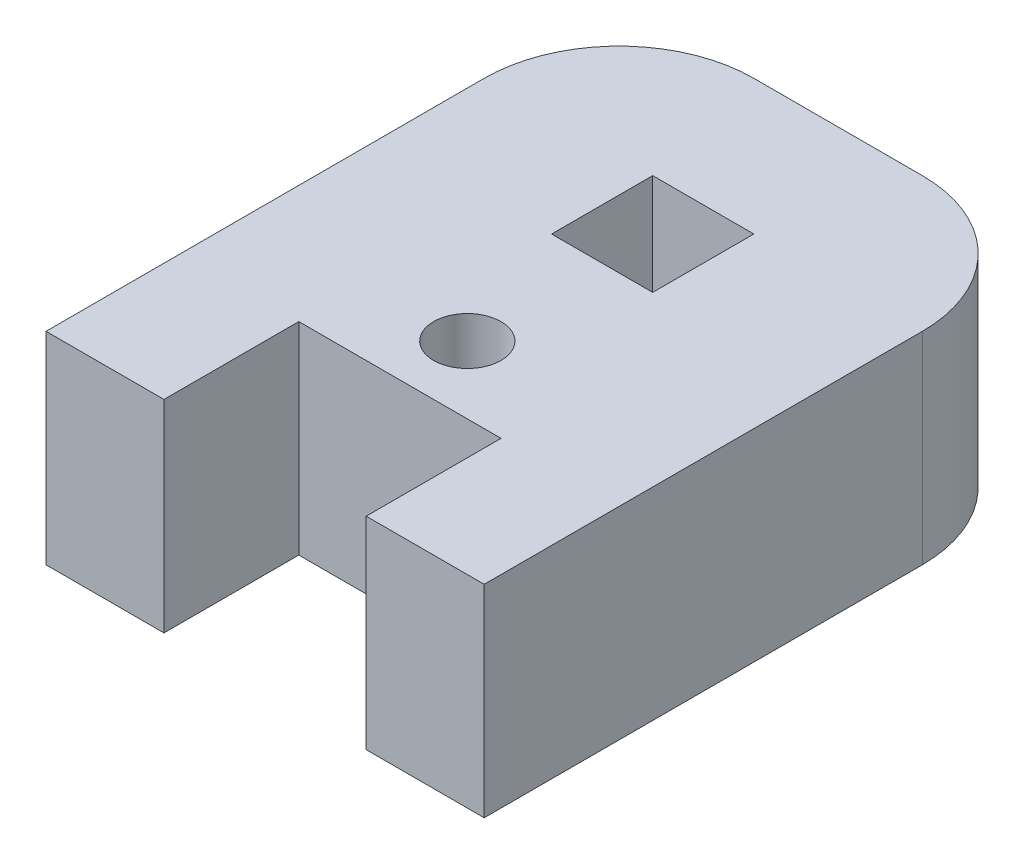
ISO-10303-21;
HEADER;
FILE_DESCRIPTION(('STEP AP214'),'2;1');
FILE_NAME('part.step','',(''),(''),'','','');
FILE_SCHEMA(('AUTOMOTIVE_DESIGN { 1 0 10303 214 1 1 1 1 }'));
ENDSEC;
DATA;
#1=APPLICATION_CONTEXT('core data for automotive mechanical design processes');
#2=APPLICATION_PROTOCOL_DEFINITION('international standard','automotive_design',2000,#1);
#3=PRODUCT_CONTEXT('',#1,'mechanical');
#4=PRODUCT('Part','Part','',(#3));
#5=PRODUCT_RELATED_PRODUCT_CATEGORY('part','',(#4));
#6=PRODUCT_DEFINITION_FORMATION('','',#4);
#7=PRODUCT_DEFINITION_CONTEXT('part definition',#1,'design');
#8=PRODUCT_DEFINITION('design','',#6,#7);
#9=PRODUCT_DEFINITION_SHAPE('','',#8);
#10=(LENGTH_UNIT() NAMED_UNIT(*) SI_UNIT(.MILLI.,.METRE.));
#11=(NAMED_UNIT(*) PLANE_ANGLE_UNIT() SI_UNIT($,.RADIAN.));
#12=(NAMED_UNIT(*) SI_UNIT($,.STERADIAN.) SOLID_ANGLE_UNIT());
#13=UNCERTAINTY_MEASURE_WITH_UNIT(LENGTH_MEASURE(1.E-05),#10,'distance_accuracy_value','');
#14=(GEOMETRIC_REPRESENTATION_CONTEXT(3) GLOBAL_UNCERTAINTY_ASSIGNED_CONTEXT((#13)) GLOBAL_UNIT_ASSIGNED_CONTEXT((#10,
#11,#12)) REPRESENTATION_CONTEXT('',''));
#15=CARTESIAN_POINT('',(0.,0.,0.));
#16=DIRECTION('',(0.,0.,1.));
#17=DIRECTION('',(1.,0.,0.));
#18=AXIS2_PLACEMENT_3D('',#15,#16,#17);
#19=CARTESIAN_POINT('',(0.,6.,0.));
#20=DIRECTION('',(1.,0.,0.));
#21=DIRECTION('',(0.,0.,-1.));
#22=AXIS2_PLACEMENT_3D('',#19,#20,#21);
#23=PLANE('',#22);
#24=DIRECTION('',(0.,0.,1.));
#25=VECTOR('',#24,1.);
#26=CARTESIAN_POINT('',(0.,6.,0.));
#27=LINE('',#26,#25);
#28=CARTESIAN_POINT('',(0.,6.,-13.));
#29=VERTEX_POINT('',#28);
#30=CARTESIAN_POINT('',(0.,6.,0.));
#31=VERTEX_POINT('',#30);
#32=EDGE_CURVE('E188',#29,#31,#27,.T.);
#33=ORIENTED_EDGE('',*,*,#32,.F.);
#34=DIRECTION('',(0.,-1.,0.));
#35=VECTOR('',#34,1.);
#36=CARTESIAN_POINT('',(0.,6.,-13.));
#37=LINE('',#36,#35);
#38=CARTESIAN_POINT('',(0.,0.,-13.));
#39=VERTEX_POINT('',#38);
#40=EDGE_CURVE('E11',#29,#39,#37,.T.);
#41=ORIENTED_EDGE('',*,*,#40,.T.);
#42=DIRECTION('',(0.,0.,1.));
#43=VECTOR('',#42,1.);
#44=CARTESIAN_POINT('',(0.,0.,0.));
#45=LINE('',#44,#43);
#46=CARTESIAN_POINT('',(0.,0.,0.));
#47=VERTEX_POINT('',#46);
#48=EDGE_CURVE('E185',#39,#47,#45,.T.);
#49=ORIENTED_EDGE('',*,*,#48,.T.);
#50=DIRECTION('',(0.,-1.,0.));
#51=VECTOR('',#50,1.);
#52=CARTESIAN_POINT('',(0.,6.,0.));
#53=LINE('',#52,#51);
#54=EDGE_CURVE('E235',#31,#47,#53,.T.);
#55=ORIENTED_EDGE('',*,*,#54,.F.);
#56=EDGE_LOOP('',(#33,#41,#49,#55));
#57=FACE_BOUND('',#56,.T.);
#58=ADVANCED_FACE('F34',(#57),#23,.F.);
#59=CARTESIAN_POINT('',(0.,6.,0.));
#60=DIRECTION('',(0.,0.,-1.));
#61=DIRECTION('',(-1.,0.,0.));
#62=AXIS2_PLACEMENT_3D('',#59,#60,#61);
#63=PLANE('',#62);
#64=DIRECTION('',(1.,0.,0.));
#65=VECTOR('',#64,1.);
#66=CARTESIAN_POINT('',(0.,0.,0.));
#67=LINE('',#66,#65);
#68=CARTESIAN_POINT('',(3.5,0.,0.));
#69=VERTEX_POINT('',#68);
#70=EDGE_CURVE('E207',#47,#69,#67,.T.);
#71=ORIENTED_EDGE('',*,*,#70,.T.);
#72=DIRECTION('',(0.,-1.,0.));
#73=VECTOR('',#72,1.);
#74=CARTESIAN_POINT('',(3.5,6.,0.));
#75=LINE('',#74,#73);
#76=CARTESIAN_POINT('',(3.5,6.,0.));
#77=VERTEX_POINT('',#76);
#78=EDGE_CURVE('E232',#77,#69,#75,.T.);
#79=ORIENTED_EDGE('',*,*,#78,.F.);
#80=DIRECTION('',(1.,0.,0.));
#81=VECTOR('',#80,1.);
#82=CARTESIAN_POINT('',(0.,6.,0.));
#83=LINE('',#82,#81);
#84=EDGE_CURVE('E190',#31,#77,#83,.T.);
#85=ORIENTED_EDGE('',*,*,#84,.F.);
#86=ORIENTED_EDGE('',*,*,#54,.T.);
#87=EDGE_LOOP('',(#71,#79,#85,#86));
#88=FACE_BOUND('',#87,.T.);
#89=ADVANCED_FACE('F287',(#88),#63,.F.);
#90=CARTESIAN_POINT('',(3.5,6.,0.));
#91=DIRECTION('',(-1.,0.,0.));
#92=DIRECTION('',(0.,0.,1.));
#93=AXIS2_PLACEMENT_3D('',#90,#91,#92);
#94=PLANE('',#93);
#95=DIRECTION('',(0.,0.,-1.));
#96=VECTOR('',#95,1.);
#97=CARTESIAN_POINT('',(3.5,0.,0.));
#98=LINE('',#97,#96);
#99=CARTESIAN_POINT('',(3.5,0.,-4.));
#100=VERTEX_POINT('',#99);
#101=EDGE_CURVE('E209',#69,#100,#98,.T.);
#102=ORIENTED_EDGE('',*,*,#101,.T.);
#103=DIRECTION('',(0.,-1.,0.));
#104=VECTOR('',#103,1.);
#105=CARTESIAN_POINT('',(3.5,6.,-4.));
#106=LINE('',#105,#104);
#107=CARTESIAN_POINT('',(3.5,6.,-4.));
#108=VERTEX_POINT('',#107);
#109=EDGE_CURVE('E229',#108,#100,#106,.T.);
#110=ORIENTED_EDGE('',*,*,#109,.F.);
#111=DIRECTION('',(0.,0.,-1.));
#112=VECTOR('',#111,1.);
#113=CARTESIAN_POINT('',(3.5,6.,0.));
#114=LINE('',#113,#112);
#115=EDGE_CURVE('E193',#77,#108,#114,.T.);
#116=ORIENTED_EDGE('',*,*,#115,.F.);
#117=ORIENTED_EDGE('',*,*,#78,.T.);
#118=EDGE_LOOP('',(#102,#110,#116,#117));
#119=FACE_BOUND('',#118,.T.);
#120=ADVANCED_FACE('F280',(#119),#94,.F.);
#121=CARTESIAN_POINT('',(3.5,6.,-4.));
#122=DIRECTION('',(0.,0.,-1.));
#123=DIRECTION('',(-1.,0.,0.));
#124=AXIS2_PLACEMENT_3D('',#121,#122,#123);
#125=PLANE('',#124);
#126=DIRECTION('',(1.,0.,0.));
#127=VECTOR('',#126,1.);
#128=CARTESIAN_POINT('',(3.5,0.,-4.));
#129=LINE('',#128,#127);
#130=CARTESIAN_POINT('',(9.5,0.,-4.));
#131=VERTEX_POINT('',#130);
#132=EDGE_CURVE('E211',#100,#131,#129,.T.);
#133=ORIENTED_EDGE('',*,*,#132,.T.);
#134=DIRECTION('',(0.,-1.,0.));
#135=VECTOR('',#134,1.);
#136=CARTESIAN_POINT('',(9.5,6.,-4.));
#137=LINE('',#136,#135);
#138=CARTESIAN_POINT('',(9.5,6.,-4.));
#139=VERTEX_POINT('',#138);
#140=EDGE_CURVE('E226',#139,#131,#137,.T.);
#141=ORIENTED_EDGE('',*,*,#140,.F.);
#142=DIRECTION('',(1.,0.,0.));
#143=VECTOR('',#142,1.);
#144=CARTESIAN_POINT('',(3.5,6.,-4.));
#145=LINE('',#144,#143);
#146=EDGE_CURVE('E195',#108,#139,#145,.T.);
#147=ORIENTED_EDGE('',*,*,#146,.F.);
#148=ORIENTED_EDGE('',*,*,#109,.T.);
#149=EDGE_LOOP('',(#133,#141,#147,#148));
#150=FACE_BOUND('',#149,.T.);
#151=ADVANCED_FACE('F276',(#150),#125,.F.);
#152=CARTESIAN_POINT('',(9.5,6.,-4.));
#153=DIRECTION('',(1.,0.,0.));
#154=DIRECTION('',(0.,0.,-1.));
#155=AXIS2_PLACEMENT_3D('',#152,#153,#154);
#156=PLANE('',#155);
#157=DIRECTION('',(0.,0.,1.));
#158=VECTOR('',#157,1.);
#159=CARTESIAN_POINT('',(9.5,0.,-4.));
#160=LINE('',#159,#158);
#161=CARTESIAN_POINT('',(9.5,0.,0.));
#162=VERTEX_POINT('',#161);
#163=EDGE_CURVE('E213',#131,#162,#160,.T.);
#164=ORIENTED_EDGE('',*,*,#163,.T.);
#165=DIRECTION('',(0.,-1.,0.));
#166=VECTOR('',#165,1.);
#167=CARTESIAN_POINT('',(9.5,6.,0.));
#168=LINE('',#167,#166);
#169=CARTESIAN_POINT('',(9.5,6.,0.));
#170=VERTEX_POINT('',#169);
#171=EDGE_CURVE('E223',#170,#162,#168,.T.);
#172=ORIENTED_EDGE('',*,*,#171,.F.);
#173=DIRECTION('',(0.,0.,1.));
#174=VECTOR('',#173,1.);
#175=CARTESIAN_POINT('',(9.5,6.,-4.));
#176=LINE('',#175,#174);
#177=EDGE_CURVE('E197',#139,#170,#176,.T.);
#178=ORIENTED_EDGE('',*,*,#177,.F.);
#179=ORIENTED_EDGE('',*,*,#140,.T.);
#180=EDGE_LOOP('',(#164,#172,#178,#179));
#181=FACE_BOUND('',#180,.T.);
#182=ADVANCED_FACE('F271',(#181),#156,.F.);
#183=CARTESIAN_POINT('',(9.5,6.,0.));
#184=DIRECTION('',(0.,0.,-1.));
#185=DIRECTION('',(-1.,0.,0.));
#186=AXIS2_PLACEMENT_3D('',#183,#184,#185);
#187=PLANE('',#186);
#188=DIRECTION('',(1.,0.,0.));
#189=VECTOR('',#188,1.);
#190=CARTESIAN_POINT('',(9.5,0.,0.));
#191=LINE('',#190,#189);
#192=CARTESIAN_POINT('',(13.,0.,0.));
#193=VERTEX_POINT('',#192);
#194=EDGE_CURVE('E215',#162,#193,#191,.T.);
#195=ORIENTED_EDGE('',*,*,#194,.T.);
#196=DIRECTION('',(0.,-1.,0.));
#197=VECTOR('',#196,1.);
#198=CARTESIAN_POINT('',(13.,6.,0.));
#199=LINE('',#198,#197);
#200=CARTESIAN_POINT('',(13.,6.,0.));
#201=VERTEX_POINT('',#200);
#202=EDGE_CURVE('E205',#201,#193,#199,.T.);
#203=ORIENTED_EDGE('',*,*,#202,.F.);
#204=DIRECTION('',(1.,0.,0.));
#205=VECTOR('',#204,1.);
#206=CARTESIAN_POINT('',(9.5,6.,0.));
#207=LINE('',#206,#205);
#208=EDGE_CURVE('E199',#170,#201,#207,.T.);
#209=ORIENTED_EDGE('',*,*,#208,.F.);
#210=ORIENTED_EDGE('',*,*,#171,.T.);
#211=EDGE_LOOP('',(#195,#203,#209,#210));
#212=FACE_BOUND('',#211,.T.);
#213=ADVANCED_FACE('F265',(#212),#187,.F.);
#214=CARTESIAN_POINT('',(13.,6.,0.));
#215=DIRECTION('',(-1.,0.,0.));
#216=DIRECTION('',(0.,0.,1.));
#217=AXIS2_PLACEMENT_3D('',#214,#215,#216);
#218=PLANE('',#217);
#219=DIRECTION('',(0.,0.,-1.));
#220=VECTOR('',#219,1.);
#221=CARTESIAN_POINT('',(13.,0.,0.));
#222=LINE('',#221,#220);
#223=CARTESIAN_POINT('',(13.,0.,-13.));
#224=VERTEX_POINT('',#223);
#225=EDGE_CURVE('E217',#193,#224,#222,.T.);
#226=ORIENTED_EDGE('',*,*,#225,.T.);
#227=DIRECTION('',(0.,-1.,0.));
#228=VECTOR('',#227,1.);
#229=CARTESIAN_POINT('',(13.,6.,-13.));
#230=LINE('',#229,#228);
#231=CARTESIAN_POINT('',(13.,6.,-13.));
#232=VERTEX_POINT('',#231);
#233=EDGE_CURVE('E57',#224,#232,#230,.F.);
#234=ORIENTED_EDGE('',*,*,#233,.T.);
#235=DIRECTION('',(0.,0.,-1.));
#236=VECTOR('',#235,1.);
#237=CARTESIAN_POINT('',(13.,6.,0.));
#238=LINE('',#237,#236);
#239=EDGE_CURVE('E201',#201,#232,#238,.T.);
#240=ORIENTED_EDGE('',*,*,#239,.F.);
#241=ORIENTED_EDGE('',*,*,#202,.T.);
#242=EDGE_LOOP('',(#226,#234,#240,#241));
#243=FACE_BOUND('',#242,.T.);
#244=ADVANCED_FACE('F261',(#243),#218,.F.);
#245=CARTESIAN_POINT('',(0.,6.,-17.));
#246=DIRECTION('',(0.,0.,1.));
#247=DIRECTION('',(1.,0.,0.));
#248=AXIS2_PLACEMENT_3D('',#245,#246,#247);
#249=PLANE('',#248);
#250=DIRECTION('',(-1.,0.,0.));
#251=VECTOR('',#250,1.);
#252=CARTESIAN_POINT('',(0.,6.,-17.));
#253=LINE('',#252,#251);
#254=CARTESIAN_POINT('',(9.,6.,-17.));
#255=VERTEX_POINT('',#254);
#256=CARTESIAN_POINT('',(4.,6.,-17.));
#257=VERTEX_POINT('',#256);
#258=EDGE_CURVE('E203',#255,#257,#253,.T.);
#259=ORIENTED_EDGE('',*,*,#258,.F.);
#260=DIRECTION('',(0.,-1.,0.));
#261=VECTOR('',#260,1.);
#262=CARTESIAN_POINT('',(9.,6.,-17.));
#263=LINE('',#262,#261);
#264=CARTESIAN_POINT('',(9.,0.,-17.));
#265=VERTEX_POINT('',#264);
#266=EDGE_CURVE('E240',#255,#265,#263,.T.);
#267=ORIENTED_EDGE('',*,*,#266,.T.);
#268=DIRECTION('',(-1.,0.,0.));
#269=VECTOR('',#268,1.);
#270=CARTESIAN_POINT('',(0.,0.,-17.));
#271=LINE('',#270,#269);
#272=CARTESIAN_POINT('',(4.,0.,-17.));
#273=VERTEX_POINT('',#272);
#274=EDGE_CURVE('E191',#265,#273,#271,.T.);
#275=ORIENTED_EDGE('',*,*,#274,.T.);
#276=DIRECTION('',(0.,-1.,0.));
#277=VECTOR('',#276,1.);
#278=CARTESIAN_POINT('',(4.,6.,-17.));
#279=LINE('',#278,#277);
#280=EDGE_CURVE('E238',#273,#257,#279,.F.);
#281=ORIENTED_EDGE('',*,*,#280,.T.);
#282=EDGE_LOOP('',(#259,#267,#275,#281));
#283=FACE_BOUND('',#282,.T.);
#284=ADVANCED_FACE('F254',(#283),#249,.F.);
#285=CARTESIAN_POINT('',(0.,6.,0.));
#286=DIRECTION('',(0.,-1.,0.));
#287=DIRECTION('',(0.,0.,-1.));
#288=AXIS2_PLACEMENT_3D('',#285,#286,#287);
#289=PLANE('',#288);
#290=DIRECTION('',(1.,0.,0.));
#291=VECTOR('',#290,1.);
#292=CARTESIAN_POINT('',(5.,6.,-10.));
#293=LINE('',#292,#291);
#294=CARTESIAN_POINT('',(5.,6.,-10.));
#295=VERTEX_POINT('',#294);
#296=CARTESIAN_POINT('',(8.,6.,-10.));
#297=VERTEX_POINT('',#296);
#298=EDGE_CURVE('E172',#295,#297,#293,.T.);
#299=ORIENTED_EDGE('',*,*,#298,.F.);
#300=DIRECTION('',(0.,0.,1.));
#301=VECTOR('',#300,1.);
#302=CARTESIAN_POINT('',(5.,6.,-13.));
#303=LINE('',#302,#301);
#304=CARTESIAN_POINT('',(5.,6.,-13.));
#305=VERTEX_POINT('',#304);
#306=EDGE_CURVE('E145',#305,#295,#303,.T.);
#307=ORIENTED_EDGE('',*,*,#306,.F.);
#308=DIRECTION('',(-1.,0.,0.));
#309=VECTOR('',#308,1.);
#310=CARTESIAN_POINT('',(5.,6.,-13.));
#311=LINE('',#310,#309);
#312=CARTESIAN_POINT('',(8.,6.,-13.));
#313=VERTEX_POINT('',#312);
#314=EDGE_CURVE('E163',#313,#305,#311,.T.);
#315=ORIENTED_EDGE('',*,*,#314,.F.);
#316=DIRECTION('',(0.,0.,-1.));
#317=VECTOR('',#316,1.);
#318=CARTESIAN_POINT('',(8.,6.,-13.));
#319=LINE('',#318,#317);
#320=EDGE_CURVE('E166',#297,#313,#319,.T.);
#321=ORIENTED_EDGE('',*,*,#320,.F.);
#322=EDGE_LOOP('',(#299,#307,#315,#321));
#323=FACE_BOUND('',#322,.T.);
#324=CARTESIAN_POINT('',(6.5,6.,-6.));
#325=DIRECTION('',(0.,1.,0.));
#326=DIRECTION('',(0.,0.,1.));
#327=AXIS2_PLACEMENT_3D('',#324,#325,#326);
#328=CIRCLE('',#327,1.);
#329=CARTESIAN_POINT('',(6.5,6.,-5.));
#330=VERTEX_POINT('',#329);
#331=EDGE_CURVE('E178',#330,#330,#328,.T.);
#332=ORIENTED_EDGE('',*,*,#331,.F.);
#333=EDGE_LOOP('',(#332));
#334=FACE_BOUND('',#333,.T.);
#335=ORIENTED_EDGE('',*,*,#239,.T.);
#336=CARTESIAN_POINT('',(9.,6.,-13.));
#337=DIRECTION('',(0.,-1.,0.));
#338=DIRECTION('',(0.,0.,-1.));
#339=AXIS2_PLACEMENT_3D('',#336,#337,#338);
#340=CIRCLE('',#339,4.);
#341=EDGE_CURVE('E42',#232,#255,#340,.F.);
#342=ORIENTED_EDGE('',*,*,#341,.T.);
#343=ORIENTED_EDGE('',*,*,#258,.T.);
#344=CARTESIAN_POINT('',(4.,6.,-13.));
#345=DIRECTION('',(0.,-1.,0.));
#346=DIRECTION('',(0.,0.,-1.));
#347=AXIS2_PLACEMENT_3D('',#344,#345,#346);
#348=CIRCLE('',#347,4.);
#349=EDGE_CURVE('E49',#257,#29,#348,.F.);
#350=ORIENTED_EDGE('',*,*,#349,.T.);
#351=ORIENTED_EDGE('',*,*,#32,.T.);
#352=ORIENTED_EDGE('',*,*,#84,.T.);
#353=ORIENTED_EDGE('',*,*,#115,.T.);
#354=ORIENTED_EDGE('',*,*,#146,.T.);
#355=ORIENTED_EDGE('',*,*,#177,.T.);
#356=ORIENTED_EDGE('',*,*,#208,.T.);
#357=EDGE_LOOP('',(#335,#342,#343,#350,#351,#352,#353,#354,#355,#356));
#358=FACE_BOUND('',#357,.T.);
#359=ADVANCED_FACE('F250',(#323,#334,#358),#289,.F.);
#360=CARTESIAN_POINT('',(0.,0.,0.));
#361=DIRECTION('',(0.,-1.,0.));
#362=DIRECTION('',(0.,0.,-1.));
#363=AXIS2_PLACEMENT_3D('',#360,#361,#362);
#364=PLANE('',#363);
#365=DIRECTION('',(0.,0.,1.));
#366=VECTOR('',#365,1.);
#367=CARTESIAN_POINT('',(5.,0.,-13.));
#368=LINE('',#367,#366);
#369=CARTESIAN_POINT('',(5.,0.,-13.));
#370=VERTEX_POINT('',#369);
#371=CARTESIAN_POINT('',(5.,0.,-10.));
#372=VERTEX_POINT('',#371);
#373=EDGE_CURVE('E142',#370,#372,#368,.T.);
#374=ORIENTED_EDGE('',*,*,#373,.T.);
#375=DIRECTION('',(1.,0.,0.));
#376=VECTOR('',#375,1.);
#377=CARTESIAN_POINT('',(5.,0.,-10.));
#378=LINE('',#377,#376);
#379=CARTESIAN_POINT('',(8.,0.,-10.));
#380=VERTEX_POINT('',#379);
#381=EDGE_CURVE('E154',#372,#380,#378,.T.);
#382=ORIENTED_EDGE('',*,*,#381,.T.);
#383=DIRECTION('',(0.,0.,-1.));
#384=VECTOR('',#383,1.);
#385=CARTESIAN_POINT('',(8.,0.,-13.));
#386=LINE('',#385,#384);
#387=CARTESIAN_POINT('',(8.,0.,-13.));
#388=VERTEX_POINT('',#387);
#389=EDGE_CURVE('E158',#380,#388,#386,.T.);
#390=ORIENTED_EDGE('',*,*,#389,.T.);
#391=DIRECTION('',(-1.,0.,0.));
#392=VECTOR('',#391,1.);
#393=CARTESIAN_POINT('',(5.,0.,-13.));
#394=LINE('',#393,#392);
#395=EDGE_CURVE('E150',#388,#370,#394,.T.);
#396=ORIENTED_EDGE('',*,*,#395,.T.);
#397=EDGE_LOOP('',(#374,#382,#390,#396));
#398=FACE_BOUND('',#397,.T.);
#399=CARTESIAN_POINT('',(6.5,0.,-6.));
#400=DIRECTION('',(0.,1.,0.));
#401=DIRECTION('',(0.,0.,1.));
#402=AXIS2_PLACEMENT_3D('',#399,#400,#401);
#403=CIRCLE('',#402,1.);
#404=CARTESIAN_POINT('',(6.5,0.,-5.));
#405=VERTEX_POINT('',#404);
#406=EDGE_CURVE('E182',#405,#405,#403,.T.);
#407=ORIENTED_EDGE('',*,*,#406,.T.);
#408=EDGE_LOOP('',(#407));
#409=FACE_BOUND('',#408,.T.);
#410=ORIENTED_EDGE('',*,*,#274,.F.);
#411=CARTESIAN_POINT('',(9.,0.,-13.));
#412=DIRECTION('',(0.,-1.,0.));
#413=DIRECTION('',(0.,0.,-1.));
#414=AXIS2_PLACEMENT_3D('',#411,#412,#413);
#415=CIRCLE('',#414,4.);
#416=EDGE_CURVE('E245',#265,#224,#415,.T.);
#417=ORIENTED_EDGE('',*,*,#416,.T.);
#418=ORIENTED_EDGE('',*,*,#225,.F.);
#419=ORIENTED_EDGE('',*,*,#194,.F.);
#420=ORIENTED_EDGE('',*,*,#163,.F.);
#421=ORIENTED_EDGE('',*,*,#132,.F.);
#422=ORIENTED_EDGE('',*,*,#101,.F.);
#423=ORIENTED_EDGE('',*,*,#70,.F.);
#424=ORIENTED_EDGE('',*,*,#48,.F.);
#425=CARTESIAN_POINT('',(4.,0.,-13.));
#426=DIRECTION('',(0.,-1.,0.));
#427=DIRECTION('',(0.,0.,-1.));
#428=AXIS2_PLACEMENT_3D('',#425,#426,#427);
#429=CIRCLE('',#428,4.);
#430=EDGE_CURVE('E243',#39,#273,#429,.T.);
#431=ORIENTED_EDGE('',*,*,#430,.T.);
#432=EDGE_LOOP('',(#410,#417,#418,#419,#420,#421,#422,#423,#424,#431));
#433=FACE_BOUND('',#432,.T.);
#434=ADVANCED_FACE('F160',(#398,#409,#433),#364,.T.);
#435=CARTESIAN_POINT('',(6.5,0.,-6.));
#436=DIRECTION('',(0.,1.,0.));
#437=DIRECTION('',(0.,0.,1.));
#438=AXIS2_PLACEMENT_3D('',#435,#436,#437);
#439=CYLINDRICAL_SURFACE('',#438,1.);
#440=ORIENTED_EDGE('',*,*,#406,.F.);
#441=EDGE_LOOP('',(#440));
#442=FACE_BOUND('',#441,.T.);
#443=ORIENTED_EDGE('',*,*,#331,.T.);
#444=EDGE_LOOP('',(#443));
#445=FACE_BOUND('',#444,.T.);
#446=ADVANCED_FACE('F317',(#442,#445),#439,.F.);
#447=CARTESIAN_POINT('',(5.,0.,-13.));
#448=DIRECTION('',(-1.,0.,0.));
#449=DIRECTION('',(0.,0.,1.));
#450=AXIS2_PLACEMENT_3D('',#447,#448,#449);
#451=PLANE('',#450);
#452=ORIENTED_EDGE('',*,*,#306,.T.);
#453=DIRECTION('',(0.,1.,0.));
#454=VECTOR('',#453,1.);
#455=CARTESIAN_POINT('',(5.,0.,-10.));
#456=LINE('',#455,#454);
#457=EDGE_CURVE('E138',#372,#295,#456,.T.);
#458=ORIENTED_EDGE('',*,*,#457,.F.);
#459=ORIENTED_EDGE('',*,*,#373,.F.);
#460=DIRECTION('',(0.,1.,0.));
#461=VECTOR('',#460,1.);
#462=CARTESIAN_POINT('',(5.,0.,-13.));
#463=LINE('',#462,#461);
#464=EDGE_CURVE('E176',#370,#305,#463,.T.);
#465=ORIENTED_EDGE('',*,*,#464,.T.);
#466=EDGE_LOOP('',(#452,#458,#459,#465));
#467=FACE_BOUND('',#466,.T.);
#468=ADVANCED_FACE('F140',(#467),#451,.F.);
#469=CARTESIAN_POINT('',(5.,0.,-13.));
#470=DIRECTION('',(0.,0.,-1.));
#471=DIRECTION('',(-1.,0.,0.));
#472=AXIS2_PLACEMENT_3D('',#469,#470,#471);
#473=PLANE('',#472);
#474=ORIENTED_EDGE('',*,*,#314,.T.);
#475=ORIENTED_EDGE('',*,*,#464,.F.);
#476=ORIENTED_EDGE('',*,*,#395,.F.);
#477=DIRECTION('',(0.,1.,0.));
#478=VECTOR('',#477,1.);
#479=CARTESIAN_POINT('',(8.,0.,-13.));
#480=LINE('',#479,#478);
#481=EDGE_CURVE('E179',#388,#313,#480,.T.);
#482=ORIENTED_EDGE('',*,*,#481,.T.);
#483=EDGE_LOOP('',(#474,#475,#476,#482));
#484=FACE_BOUND('',#483,.T.);
#485=ADVANCED_FACE('F326',(#484),#473,.F.);
#486=CARTESIAN_POINT('',(8.,0.,-13.));
#487=DIRECTION('',(1.,0.,0.));
#488=DIRECTION('',(0.,0.,-1.));
#489=AXIS2_PLACEMENT_3D('',#486,#487,#488);
#490=PLANE('',#489);
#491=ORIENTED_EDGE('',*,*,#320,.T.);
#492=ORIENTED_EDGE('',*,*,#481,.F.);
#493=ORIENTED_EDGE('',*,*,#389,.F.);
#494=DIRECTION('',(0.,1.,0.));
#495=VECTOR('',#494,1.);
#496=CARTESIAN_POINT('',(8.,0.,-10.));
#497=LINE('',#496,#495);
#498=EDGE_CURVE('E149',#380,#297,#497,.T.);
#499=ORIENTED_EDGE('',*,*,#498,.T.);
#500=EDGE_LOOP('',(#491,#492,#493,#499));
#501=FACE_BOUND('',#500,.T.);
#502=ADVANCED_FACE('F329',(#501),#490,.F.);
#503=CARTESIAN_POINT('',(5.,0.,-10.));
#504=DIRECTION('',(0.,0.,1.));
#505=DIRECTION('',(1.,0.,0.));
#506=AXIS2_PLACEMENT_3D('',#503,#504,#505);
#507=PLANE('',#506);
#508=ORIENTED_EDGE('',*,*,#298,.T.);
#509=ORIENTED_EDGE('',*,*,#498,.F.);
#510=ORIENTED_EDGE('',*,*,#381,.F.);
#511=ORIENTED_EDGE('',*,*,#457,.T.);
#512=EDGE_LOOP('',(#508,#509,#510,#511));
#513=FACE_BOUND('',#512,.T.);
#514=ADVANCED_FACE('F155',(#513),#507,.F.);
#515=CARTESIAN_POINT('',(9.,6.,-13.));
#516=DIRECTION('',(0.,-1.,0.));
#517=DIRECTION('',(0.,0.,-1.));
#518=AXIS2_PLACEMENT_3D('',#515,#516,#517);
#519=CYLINDRICAL_SURFACE('',#518,4.);
#520=ORIENTED_EDGE('',*,*,#341,.F.);
#521=ORIENTED_EDGE('',*,*,#233,.F.);
#522=ORIENTED_EDGE('',*,*,#416,.F.);
#523=ORIENTED_EDGE('',*,*,#266,.F.);
#524=EDGE_LOOP('',(#520,#521,#522,#523));
#525=FACE_BOUND('',#524,.T.);
#526=ADVANCED_FACE('F257',(#525),#519,.T.);
#527=CARTESIAN_POINT('',(4.,6.,-13.));
#528=DIRECTION('',(0.,-1.,0.));
#529=DIRECTION('',(0.,0.,-1.));
#530=AXIS2_PLACEMENT_3D('',#527,#528,#529);
#531=CYLINDRICAL_SURFACE('',#530,4.);
#532=ORIENTED_EDGE('',*,*,#349,.F.);
#533=ORIENTED_EDGE('',*,*,#280,.F.);
#534=ORIENTED_EDGE('',*,*,#430,.F.);
#535=ORIENTED_EDGE('',*,*,#40,.F.);
#536=EDGE_LOOP('',(#532,#533,#534,#535));
#537=FACE_BOUND('',#536,.T.);
#538=ADVANCED_FACE('F36',(#537),#531,.T.);
#539=CLOSED_SHELL('',(#58,#89,#120,#151,#182,#213,#244,#284,#359,#434,#446,#468,#485,#502,#514,
#526,#538));
#540=MANIFOLD_SOLID_BREP('B2',#539);
#541=ADVANCED_BREP_SHAPE_REPRESENTATION('',(#18,#540),#14);
#542=SHAPE_DEFINITION_REPRESENTATION(#9,#541);
ENDSEC;
END-ISO-10303-21;
